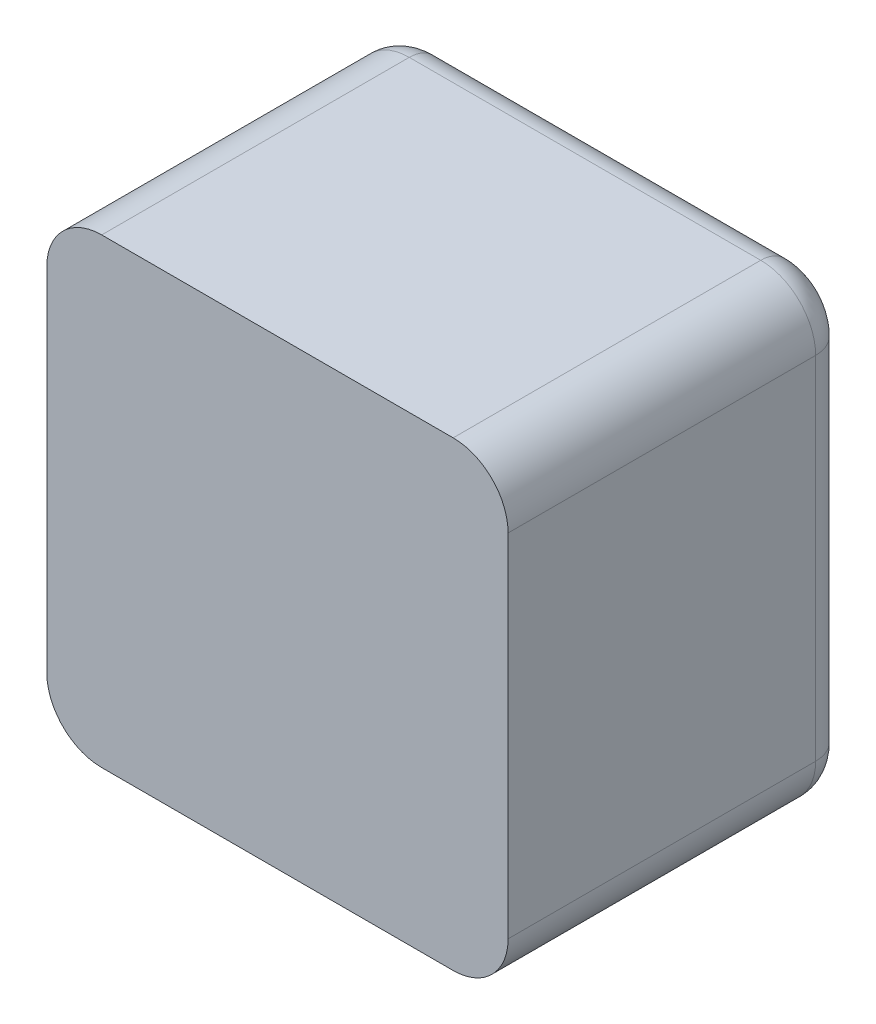
ISO-10303-21;
HEADER;
FILE_DESCRIPTION(('STEP AP214'),'2;1');
FILE_NAME('part.step','',(''),(''),'','','');
FILE_SCHEMA(('AUTOMOTIVE_DESIGN { 1 0 10303 214 1 1 1 1 }'));
ENDSEC;
DATA;
#1=APPLICATION_CONTEXT('core data for automotive mechanical design processes');
#2=APPLICATION_PROTOCOL_DEFINITION('international standard','automotive_design',2000,#1);
#3=PRODUCT_CONTEXT('',#1,'mechanical');
#4=PRODUCT('Part','Part','',(#3));
#5=PRODUCT_RELATED_PRODUCT_CATEGORY('part','',(#4));
#6=PRODUCT_DEFINITION_FORMATION('','',#4);
#7=PRODUCT_DEFINITION_CONTEXT('part definition',#1,'design');
#8=PRODUCT_DEFINITION('design','',#6,#7);
#9=PRODUCT_DEFINITION_SHAPE('','',#8);
#10=(LENGTH_UNIT() NAMED_UNIT(*) SI_UNIT(.MILLI.,.METRE.));
#11=(NAMED_UNIT(*) PLANE_ANGLE_UNIT() SI_UNIT($,.RADIAN.));
#12=(NAMED_UNIT(*) SI_UNIT($,.STERADIAN.) SOLID_ANGLE_UNIT());
#13=UNCERTAINTY_MEASURE_WITH_UNIT(LENGTH_MEASURE(1.E-05),#10,'distance_accuracy_value','');
#14=(GEOMETRIC_REPRESENTATION_CONTEXT(3) GLOBAL_UNCERTAINTY_ASSIGNED_CONTEXT((#13)) GLOBAL_UNIT_ASSIGNED_CONTEXT((#10,
#11,#12)) REPRESENTATION_CONTEXT('',''));
#15=CARTESIAN_POINT('',(0.,0.,0.));
#16=DIRECTION('',(0.,0.,1.));
#17=DIRECTION('',(1.,0.,0.));
#18=AXIS2_PLACEMENT_3D('',#15,#16,#17);
#19=CARTESIAN_POINT('',(-29.6481980703746,-27.890625,60.));
#20=DIRECTION('',(0.,1.,0.));
#21=DIRECTION('',(0.,0.,1.));
#22=AXIS2_PLACEMENT_3D('',#19,#20,#21);
#23=PLANE('',#22);
#24=DIRECTION('',(0.,0.,-1.));
#25=VECTOR('',#24,1.);
#26=CARTESIAN_POINT('',(-19.6481980703746,-27.890625,60.));
#27=LINE('',#26,#25);
#28=CARTESIAN_POINT('',(-19.6481980703746,-27.890625,62.));
#29=VERTEX_POINT('',#28);
#30=CARTESIAN_POINT('',(-19.6481980703746,-27.890625,6.));
#31=VERTEX_POINT('',#30);
#32=EDGE_CURVE('E199',#29,#31,#27,.T.);
#33=ORIENTED_EDGE('',*,*,#32,.T.);
#34=DIRECTION('',(1.,0.,0.));
#35=VECTOR('',#34,1.);
#36=CARTESIAN_POINT('',(-29.6481980703746,-27.890625,6.));
#37=LINE('',#36,#35);
#38=CARTESIAN_POINT('',(44.3518019296254,-27.890625,6.));
#39=VERTEX_POINT('',#38);
#40=EDGE_CURVE('E381',#31,#39,#37,.T.);
#41=ORIENTED_EDGE('',*,*,#40,.T.);
#42=DIRECTION('',(0.,0.,-1.));
#43=VECTOR('',#42,1.);
#44=CARTESIAN_POINT('',(44.3518019296254,-27.890625,60.));
#45=LINE('',#44,#43);
#46=CARTESIAN_POINT('',(44.3518019296253,-27.890625,62.));
#47=VERTEX_POINT('',#46);
#48=EDGE_CURVE('E210',#39,#47,#45,.F.);
#49=ORIENTED_EDGE('',*,*,#48,.T.);
#50=DIRECTION('',(1.,0.,0.));
#51=VECTOR('',#50,1.);
#52=CARTESIAN_POINT('',(-19.6481980703746,-27.890625,62.));
#53=LINE('',#52,#51);
#54=EDGE_CURVE('E213',#29,#47,#53,.T.);
#55=ORIENTED_EDGE('',*,*,#54,.F.);
#56=EDGE_LOOP('',(#33,#41,#49,#55));
#57=FACE_BOUND('',#56,.T.);
#58=DIRECTION('',(-1.,0.,0.));
#59=VECTOR('',#58,1.);
#60=CARTESIAN_POINT('',(24.3518019296254,-27.890625,57.));
#61=LINE('',#60,#59);
#62=CARTESIAN_POINT('',(24.3518019296254,-27.890625,57.));
#63=VERTEX_POINT('',#62);
#64=CARTESIAN_POINT('',(0.351801929625378,-27.890625,57.));
#65=VERTEX_POINT('',#64);
#66=EDGE_CURVE('E280',#63,#65,#61,.T.);
#67=ORIENTED_EDGE('',*,*,#66,.F.);
#68=CARTESIAN_POINT('',(24.3518019296254,-27.890625,42.));
#69=DIRECTION('',(0.,1.,0.));
#70=DIRECTION('',(0.,0.,1.));
#71=AXIS2_PLACEMENT_3D('',#68,#69,#70);
#72=CIRCLE('',#71,15.);
#73=CARTESIAN_POINT('',(39.3518019296254,-27.890625,42.));
#74=VERTEX_POINT('',#73);
#75=EDGE_CURVE('E287',#63,#74,#72,.T.);
#76=ORIENTED_EDGE('',*,*,#75,.T.);
#77=DIRECTION('',(0.,0.,-1.));
#78=VECTOR('',#77,1.);
#79=CARTESIAN_POINT('',(39.3518019296254,-27.890625,42.));
#80=LINE('',#79,#78);
#81=CARTESIAN_POINT('',(39.3518019296254,-27.890625,25.));
#82=VERTEX_POINT('',#81);
#83=EDGE_CURVE('E62',#74,#82,#80,.T.);
#84=ORIENTED_EDGE('',*,*,#83,.T.);
#85=CARTESIAN_POINT('',(24.3518019296254,-27.890625,25.));
#86=DIRECTION('',(0.,1.,0.));
#87=DIRECTION('',(0.,0.,1.));
#88=AXIS2_PLACEMENT_3D('',#85,#86,#87);
#89=CIRCLE('',#88,15.);
#90=CARTESIAN_POINT('',(24.3518019296254,-27.890625,10.));
#91=VERTEX_POINT('',#90);
#92=EDGE_CURVE('E320',#82,#91,#89,.T.);
#93=ORIENTED_EDGE('',*,*,#92,.T.);
#94=DIRECTION('',(-1.,0.,0.));
#95=VECTOR('',#94,1.);
#96=CARTESIAN_POINT('',(24.3518019296254,-27.890625,9.99999999999999));
#97=LINE('',#96,#95);
#98=CARTESIAN_POINT('',(0.35180192962538,-27.890625,9.99999999999999));
#99=VERTEX_POINT('',#98);
#100=EDGE_CURVE('E317',#91,#99,#97,.T.);
#101=ORIENTED_EDGE('',*,*,#100,.T.);
#102=CARTESIAN_POINT('',(0.351801929625378,-27.890625,25.));
#103=DIRECTION('',(0.,1.,0.));
#104=DIRECTION('',(0.,0.,1.));
#105=AXIS2_PLACEMENT_3D('',#102,#103,#104);
#106=CIRCLE('',#105,15.);
#107=CARTESIAN_POINT('',(-14.6481980703746,-27.890625,25.));
#108=VERTEX_POINT('',#107);
#109=EDGE_CURVE('E314',#99,#108,#106,.T.);
#110=ORIENTED_EDGE('',*,*,#109,.T.);
#111=DIRECTION('',(0.,0.,-1.));
#112=VECTOR('',#111,1.);
#113=CARTESIAN_POINT('',(-14.6481980703746,-27.890625,42.));
#114=LINE('',#113,#112);
#115=CARTESIAN_POINT('',(-14.6481980703746,-27.890625,42.));
#116=VERTEX_POINT('',#115);
#117=EDGE_CURVE('E311',#116,#108,#114,.T.);
#118=ORIENTED_EDGE('',*,*,#117,.F.);
#119=CARTESIAN_POINT('',(0.351801929625376,-27.890625,42.));
#120=DIRECTION('',(0.,-1.,0.));
#121=DIRECTION('',(0.,0.,-1.));
#122=AXIS2_PLACEMENT_3D('',#119,#120,#121);
#123=CIRCLE('',#122,15.);
#124=EDGE_CURVE('E309',#65,#116,#123,.T.);
#125=ORIENTED_EDGE('',*,*,#124,.F.);
#126=EDGE_LOOP('',(#67,#76,#84,#93,#101,#110,#118,#125));
#127=FACE_BOUND('',#126,.T.);
#128=ADVANCED_FACE('F37',(#57,#127),#23,.F.);
#129=CARTESIAN_POINT('',(-29.6481980703746,56.109375,60.));
#130=DIRECTION('',(1.,0.,0.));
#131=DIRECTION('',(0.,1.,0.));
#132=AXIS2_PLACEMENT_3D('',#129,#130,#131);
#133=PLANE('',#132);
#134=DIRECTION('',(0.,0.,-1.));
#135=VECTOR('',#134,1.);
#136=CARTESIAN_POINT('',(-29.6481980703746,46.109375,0.));
#137=LINE('',#136,#135);
#138=CARTESIAN_POINT('',(-29.6481980703746,46.1093749999999,62.));
#139=VERTEX_POINT('',#138);
#140=CARTESIAN_POINT('',(-29.6481980703746,46.109375,6.));
#141=VERTEX_POINT('',#140);
#142=EDGE_CURVE('E209',#139,#141,#137,.T.);
#143=ORIENTED_EDGE('',*,*,#142,.T.);
#144=DIRECTION('',(0.,-1.,0.));
#145=VECTOR('',#144,1.);
#146=CARTESIAN_POINT('',(-29.6481980703746,56.109375,6.));
#147=LINE('',#146,#145);
#148=CARTESIAN_POINT('',(-29.6481980703746,-17.890625,6.));
#149=VERTEX_POINT('',#148);
#150=EDGE_CURVE('E378',#141,#149,#147,.T.);
#151=ORIENTED_EDGE('',*,*,#150,.T.);
#152=DIRECTION('',(0.,0.,-1.));
#153=VECTOR('',#152,1.);
#154=CARTESIAN_POINT('',(-29.6481980703746,-17.890625,60.));
#155=LINE('',#154,#153);
#156=CARTESIAN_POINT('',(-29.6481980703746,-17.8906249999999,62.));
#157=VERTEX_POINT('',#156);
#158=EDGE_CURVE('E346',#149,#157,#155,.F.);
#159=ORIENTED_EDGE('',*,*,#158,.T.);
#160=DIRECTION('',(0.,-1.,0.));
#161=VECTOR('',#160,1.);
#162=CARTESIAN_POINT('',(-29.6481980703746,46.1093749999999,62.));
#163=LINE('',#162,#161);
#164=EDGE_CURVE('E225',#139,#157,#163,.T.);
#165=ORIENTED_EDGE('',*,*,#164,.F.);
#166=EDGE_LOOP('',(#143,#151,#159,#165));
#167=FACE_BOUND('',#166,.T.);
#168=ADVANCED_FACE('F451',(#167),#133,.F.);
#169=CARTESIAN_POINT('',(54.3518019296254,56.109375,60.));
#170=DIRECTION('',(1.,0.,0.));
#171=DIRECTION('',(0.,1.,0.));
#172=AXIS2_PLACEMENT_3D('',#169,#170,#171);
#173=PLANE('',#172);
#174=DIRECTION('',(0.,0.,-1.));
#175=VECTOR('',#174,1.);
#176=CARTESIAN_POINT('',(54.3518019296254,-17.890625,0.));
#177=LINE('',#176,#175);
#178=CARTESIAN_POINT('',(54.3518019296254,-17.8906249999999,62.));
#179=VERTEX_POINT('',#178);
#180=CARTESIAN_POINT('',(54.3518019296254,-17.890625,6.));
#181=VERTEX_POINT('',#180);
#182=EDGE_CURVE('E350',#179,#181,#177,.T.);
#183=ORIENTED_EDGE('',*,*,#182,.T.);
#184=DIRECTION('',(0.,-1.,0.));
#185=VECTOR('',#184,1.);
#186=CARTESIAN_POINT('',(54.3518019296254,46.109375,6.));
#187=LINE('',#186,#185);
#188=CARTESIAN_POINT('',(54.3518019296254,46.109375,6.));
#189=VERTEX_POINT('',#188);
#190=EDGE_CURVE('E385',#181,#189,#187,.F.);
#191=ORIENTED_EDGE('',*,*,#190,.T.);
#192=DIRECTION('',(0.,0.,-1.));
#193=VECTOR('',#192,1.);
#194=CARTESIAN_POINT('',(54.3518019296254,46.109375,60.));
#195=LINE('',#194,#193);
#196=CARTESIAN_POINT('',(54.3518019296254,46.1093749999999,62.));
#197=VERTEX_POINT('',#196);
#198=EDGE_CURVE('E348',#189,#197,#195,.F.);
#199=ORIENTED_EDGE('',*,*,#198,.T.);
#200=DIRECTION('',(0.,1.,0.));
#201=VECTOR('',#200,1.);
#202=CARTESIAN_POINT('',(54.3518019296254,46.1093749999999,62.));
#203=LINE('',#202,#201);
#204=EDGE_CURVE('E229',#179,#197,#203,.T.);
#205=ORIENTED_EDGE('',*,*,#204,.F.);
#206=EDGE_LOOP('',(#183,#191,#199,#205));
#207=FACE_BOUND('',#206,.T.);
#208=ADVANCED_FACE('F421',(#207),#173,.T.);
#209=CARTESIAN_POINT('',(-29.6481980703746,56.109375,60.));
#210=DIRECTION('',(0.,1.,0.));
#211=DIRECTION('',(0.,0.,1.));
#212=AXIS2_PLACEMENT_3D('',#209,#210,#211);
#213=PLANE('',#212);
#214=DIRECTION('',(0.,0.,-1.));
#215=VECTOR('',#214,1.);
#216=CARTESIAN_POINT('',(44.3518019296254,56.109375,60.));
#217=LINE('',#216,#215);
#218=CARTESIAN_POINT('',(44.3518019296253,56.109375,62.));
#219=VERTEX_POINT('',#218);
#220=CARTESIAN_POINT('',(44.3518019296254,56.109375,6.));
#221=VERTEX_POINT('',#220);
#222=EDGE_CURVE('E353',#219,#221,#217,.T.);
#223=ORIENTED_EDGE('',*,*,#222,.T.);
#224=DIRECTION('',(1.,0.,0.));
#225=VECTOR('',#224,1.);
#226=CARTESIAN_POINT('',(-19.6481980703746,56.109375,6.));
#227=LINE('',#226,#225);
#228=CARTESIAN_POINT('',(-19.6481980703746,56.109375,6.));
#229=VERTEX_POINT('',#228);
#230=EDGE_CURVE('E11',#221,#229,#227,.F.);
#231=ORIENTED_EDGE('',*,*,#230,.T.);
#232=DIRECTION('',(0.,0.,-1.));
#233=VECTOR('',#232,1.);
#234=CARTESIAN_POINT('',(-19.6481980703746,56.109375,60.));
#235=LINE('',#234,#233);
#236=CARTESIAN_POINT('',(-19.6481980703746,56.109375,62.));
#237=VERTEX_POINT('',#236);
#238=EDGE_CURVE('E356',#229,#237,#235,.F.);
#239=ORIENTED_EDGE('',*,*,#238,.T.);
#240=DIRECTION('',(-1.,0.,0.));
#241=VECTOR('',#240,1.);
#242=CARTESIAN_POINT('',(-19.6481980703746,56.109375,62.));
#243=LINE('',#242,#241);
#244=EDGE_CURVE('E235',#219,#237,#243,.T.);
#245=ORIENTED_EDGE('',*,*,#244,.F.);
#246=EDGE_LOOP('',(#223,#231,#239,#245));
#247=FACE_BOUND('',#246,.T.);
#248=ADVANCED_FACE('F431',(#247),#213,.T.);
#249=CARTESIAN_POINT('',(0.,0.,0.));
#250=DIRECTION('',(0.,0.,1.));
#251=DIRECTION('',(1.,0.,0.));
#252=AXIS2_PLACEMENT_3D('',#249,#250,#251);
#253=PLANE('',#252);
#254=CARTESIAN_POINT('',(14.3518019296254,21.109375,0.));
#255=DIRECTION('',(0.,0.,-1.));
#256=DIRECTION('',(-1.,0.,0.));
#257=AXIS2_PLACEMENT_3D('',#254,#255,#256);
#258=CIRCLE('',#257,3.175);
#259=CARTESIAN_POINT('',(11.1768019296254,21.109375,0.));
#260=VERTEX_POINT('',#259);
#261=EDGE_CURVE('E241',#260,#260,#258,.T.);
#262=ORIENTED_EDGE('',*,*,#261,.F.);
#263=EDGE_LOOP('',(#262));
#264=FACE_BOUND('',#263,.T.);
#265=DIRECTION('',(-1.,0.,0.));
#266=VECTOR('',#265,1.);
#267=CARTESIAN_POINT('',(34.8518019296254,-14.890625,0.));
#268=LINE('',#267,#266);
#269=CARTESIAN_POINT('',(34.8518019296254,-14.890625,0.));
#270=VERTEX_POINT('',#269);
#271=CARTESIAN_POINT('',(-10.1481980703746,-14.890625,0.));
#272=VERTEX_POINT('',#271);
#273=EDGE_CURVE('E261',#270,#272,#268,.T.);
#274=ORIENTED_EDGE('',*,*,#273,.F.);
#275=CARTESIAN_POINT('',(34.8518019296254,-8.39062500000001,0.));
#276=DIRECTION('',(0.,0.,-1.));
#277=DIRECTION('',(-1.,0.,0.));
#278=AXIS2_PLACEMENT_3D('',#275,#276,#277);
#279=CIRCLE('',#278,6.5);
#280=CARTESIAN_POINT('',(34.8518019296254,-1.890625,0.));
#281=VERTEX_POINT('',#280);
#282=EDGE_CURVE('E54',#281,#270,#279,.T.);
#283=ORIENTED_EDGE('',*,*,#282,.F.);
#284=DIRECTION('',(-1.,0.,0.));
#285=VECTOR('',#284,1.);
#286=CARTESIAN_POINT('',(34.8518019296254,-1.890625,0.));
#287=LINE('',#286,#285);
#288=CARTESIAN_POINT('',(-10.1481980703746,-1.890625,0.));
#289=VERTEX_POINT('',#288);
#290=EDGE_CURVE('E251',#281,#289,#287,.T.);
#291=ORIENTED_EDGE('',*,*,#290,.T.);
#292=CARTESIAN_POINT('',(-10.1481980703746,-8.390625,0.));
#293=DIRECTION('',(0.,0.,-1.));
#294=DIRECTION('',(-1.,0.,0.));
#295=AXIS2_PLACEMENT_3D('',#292,#293,#294);
#296=CIRCLE('',#295,6.5);
#297=EDGE_CURVE('E264',#272,#289,#296,.T.);
#298=ORIENTED_EDGE('',*,*,#297,.F.);
#299=EDGE_LOOP('',(#274,#283,#291,#298));
#300=FACE_BOUND('',#299,.T.);
#301=DIRECTION('',(0.,-1.,0.));
#302=VECTOR('',#301,1.);
#303=CARTESIAN_POINT('',(-23.6481980703746,0.,0.));
#304=LINE('',#303,#302);
#305=CARTESIAN_POINT('',(-23.6481980703746,-17.890625,0.));
#306=VERTEX_POINT('',#305);
#307=CARTESIAN_POINT('',(-23.6481980703746,46.109375,0.));
#308=VERTEX_POINT('',#307);
#309=EDGE_CURVE('E370',#306,#308,#304,.F.);
#310=ORIENTED_EDGE('',*,*,#309,.T.);
#311=CARTESIAN_POINT('',(-19.6481980703746,46.109375,0.));
#312=DIRECTION('',(0.,0.,1.));
#313=DIRECTION('',(1.,0.,0.));
#314=AXIS2_PLACEMENT_3D('',#311,#312,#313);
#315=CIRCLE('',#314,4.);
#316=CARTESIAN_POINT('',(-19.6481980703746,50.109375,0.));
#317=VERTEX_POINT('',#316);
#318=EDGE_CURVE('E372',#308,#317,#315,.F.);
#319=ORIENTED_EDGE('',*,*,#318,.T.);
#320=DIRECTION('',(1.,0.,0.));
#321=VECTOR('',#320,1.);
#322=CARTESIAN_POINT('',(44.3518019296253,50.109375,0.));
#323=LINE('',#322,#321);
#324=CARTESIAN_POINT('',(44.3518019296254,50.109375,0.));
#325=VERTEX_POINT('',#324);
#326=EDGE_CURVE('E358',#317,#325,#323,.T.);
#327=ORIENTED_EDGE('',*,*,#326,.T.);
#328=CARTESIAN_POINT('',(44.3518019296254,46.109375,0.));
#329=DIRECTION('',(0.,0.,1.));
#330=DIRECTION('',(1.,0.,0.));
#331=AXIS2_PLACEMENT_3D('',#328,#329,#330);
#332=CIRCLE('',#331,4.);
#333=CARTESIAN_POINT('',(48.3518019296254,46.109375,0.));
#334=VERTEX_POINT('',#333);
#335=EDGE_CURVE('E360',#325,#334,#332,.F.);
#336=ORIENTED_EDGE('',*,*,#335,.T.);
#337=DIRECTION('',(0.,-1.,0.));
#338=VECTOR('',#337,1.);
#339=CARTESIAN_POINT('',(48.3518019296254,-17.890625,0.));
#340=LINE('',#339,#338);
#341=CARTESIAN_POINT('',(48.3518019296254,-17.890625,0.));
#342=VERTEX_POINT('',#341);
#343=EDGE_CURVE('E362',#334,#342,#340,.T.);
#344=ORIENTED_EDGE('',*,*,#343,.T.);
#345=CARTESIAN_POINT('',(44.3518019296254,-17.890625,0.));
#346=DIRECTION('',(0.,0.,1.));
#347=DIRECTION('',(1.,0.,0.));
#348=AXIS2_PLACEMENT_3D('',#345,#346,#347);
#349=CIRCLE('',#348,4.);
#350=CARTESIAN_POINT('',(44.3518019296254,-21.890625,0.));
#351=VERTEX_POINT('',#350);
#352=EDGE_CURVE('E364',#342,#351,#349,.F.);
#353=ORIENTED_EDGE('',*,*,#352,.T.);
#354=DIRECTION('',(1.,0.,0.));
#355=VECTOR('',#354,1.);
#356=CARTESIAN_POINT('',(0.,-21.890625,0.));
#357=LINE('',#356,#355);
#358=CARTESIAN_POINT('',(-19.6481980703746,-21.890625,0.));
#359=VERTEX_POINT('',#358);
#360=EDGE_CURVE('E366',#351,#359,#357,.F.);
#361=ORIENTED_EDGE('',*,*,#360,.T.);
#362=CARTESIAN_POINT('',(-19.6481980703746,-17.890625,0.));
#363=DIRECTION('',(0.,0.,1.));
#364=DIRECTION('',(1.,0.,0.));
#365=AXIS2_PLACEMENT_3D('',#362,#363,#364);
#366=CIRCLE('',#365,4.);
#367=EDGE_CURVE('E368',#359,#306,#366,.F.);
#368=ORIENTED_EDGE('',*,*,#367,.T.);
#369=EDGE_LOOP('',(#310,#319,#327,#336,#344,#353,#361,#368));
#370=FACE_BOUND('',#369,.T.);
#371=ADVANCED_FACE('F460',(#264,#300,#370),#253,.F.);
#372=CARTESIAN_POINT('',(-19.6481980703746,-17.890625,60.));
#373=DIRECTION('',(0.,0.,-1.));
#374=DIRECTION('',(-1.,0.,0.));
#375=AXIS2_PLACEMENT_3D('',#372,#373,#374);
#376=CYLINDRICAL_SURFACE('',#375,10.);
#377=ORIENTED_EDGE('',*,*,#158,.F.);
#378=CARTESIAN_POINT('',(-19.6481980703746,-17.890625,6.));
#379=DIRECTION('',(0.,0.,1.));
#380=DIRECTION('',(1.,0.,0.));
#381=AXIS2_PLACEMENT_3D('',#378,#379,#380);
#382=CIRCLE('',#381,10.);
#383=EDGE_CURVE('E206',#149,#31,#382,.T.);
#384=ORIENTED_EDGE('',*,*,#383,.T.);
#385=ORIENTED_EDGE('',*,*,#32,.F.);
#386=CARTESIAN_POINT('',(-19.6481980703746,-17.890625,62.));
#387=DIRECTION('',(0.,0.,1.));
#388=DIRECTION('',(1.,0.,0.));
#389=AXIS2_PLACEMENT_3D('',#386,#387,#388);
#390=CIRCLE('',#389,10.);
#391=EDGE_CURVE('E204',#157,#29,#390,.T.);
#392=ORIENTED_EDGE('',*,*,#391,.F.);
#393=EDGE_LOOP('',(#377,#384,#385,#392));
#394=FACE_BOUND('',#393,.T.);
#395=ADVANCED_FACE('F202',(#394),#376,.T.);
#396=CARTESIAN_POINT('',(44.3518019296254,-17.890625,60.));
#397=DIRECTION('',(0.,0.,1.));
#398=DIRECTION('',(1.,0.,0.));
#399=AXIS2_PLACEMENT_3D('',#396,#397,#398);
#400=CYLINDRICAL_SURFACE('',#399,10.);
#401=ORIENTED_EDGE('',*,*,#48,.F.);
#402=CARTESIAN_POINT('',(44.3518019296254,-17.890625,6.));
#403=DIRECTION('',(0.,0.,1.));
#404=DIRECTION('',(1.,0.,0.));
#405=AXIS2_PLACEMENT_3D('',#402,#403,#404);
#406=CIRCLE('',#405,10.);
#407=EDGE_CURVE('E383',#39,#181,#406,.T.);
#408=ORIENTED_EDGE('',*,*,#407,.T.);
#409=ORIENTED_EDGE('',*,*,#182,.F.);
#410=CARTESIAN_POINT('',(44.3518019296254,-17.890625,62.));
#411=DIRECTION('',(0.,0.,1.));
#412=DIRECTION('',(1.,0.,0.));
#413=AXIS2_PLACEMENT_3D('',#410,#411,#412);
#414=CIRCLE('',#413,10.);
#415=EDGE_CURVE('E219',#47,#179,#414,.T.);
#416=ORIENTED_EDGE('',*,*,#415,.F.);
#417=EDGE_LOOP('',(#401,#408,#409,#416));
#418=FACE_BOUND('',#417,.T.);
#419=ADVANCED_FACE('F418',(#418),#400,.T.);
#420=CARTESIAN_POINT('',(-19.6481980703746,46.109375,60.));
#421=DIRECTION('',(0.,0.,1.));
#422=DIRECTION('',(1.,0.,0.));
#423=AXIS2_PLACEMENT_3D('',#420,#421,#422);
#424=CYLINDRICAL_SURFACE('',#423,10.);
#425=ORIENTED_EDGE('',*,*,#238,.F.);
#426=CARTESIAN_POINT('',(-19.6481980703746,46.109375,6.));
#427=DIRECTION('',(0.,0.,1.));
#428=DIRECTION('',(1.,0.,0.));
#429=AXIS2_PLACEMENT_3D('',#426,#427,#428);
#430=CIRCLE('',#429,10.);
#431=EDGE_CURVE('E375',#229,#141,#430,.T.);
#432=ORIENTED_EDGE('',*,*,#431,.T.);
#433=ORIENTED_EDGE('',*,*,#142,.F.);
#434=CARTESIAN_POINT('',(-19.6481980703746,46.109375,62.));
#435=DIRECTION('',(0.,0.,1.));
#436=DIRECTION('',(1.,0.,0.));
#437=AXIS2_PLACEMENT_3D('',#434,#435,#436);
#438=CIRCLE('',#437,10.);
#439=EDGE_CURVE('E238',#237,#139,#438,.T.);
#440=ORIENTED_EDGE('',*,*,#439,.F.);
#441=EDGE_LOOP('',(#425,#432,#433,#440));
#442=FACE_BOUND('',#441,.T.);
#443=ADVANCED_FACE('F448',(#442),#424,.T.);
#444=CARTESIAN_POINT('',(44.3518019296254,46.109375,60.));
#445=DIRECTION('',(0.,0.,-1.));
#446=DIRECTION('',(-1.,0.,0.));
#447=AXIS2_PLACEMENT_3D('',#444,#445,#446);
#448=CYLINDRICAL_SURFACE('',#447,10.);
#449=ORIENTED_EDGE('',*,*,#198,.F.);
#450=CARTESIAN_POINT('',(44.3518019296254,46.109375,6.));
#451=DIRECTION('',(0.,0.,1.));
#452=DIRECTION('',(1.,0.,0.));
#453=AXIS2_PLACEMENT_3D('',#450,#451,#452);
#454=CIRCLE('',#453,10.);
#455=EDGE_CURVE('E46',#189,#221,#454,.T.);
#456=ORIENTED_EDGE('',*,*,#455,.T.);
#457=ORIENTED_EDGE('',*,*,#222,.F.);
#458=CARTESIAN_POINT('',(44.3518019296254,46.109375,62.));
#459=DIRECTION('',(0.,0.,1.));
#460=DIRECTION('',(-1.,0.,0.));
#461=AXIS2_PLACEMENT_3D('',#458,#459,#460);
#462=CIRCLE('',#461,10.);
#463=EDGE_CURVE('E232',#197,#219,#462,.T.);
#464=ORIENTED_EDGE('',*,*,#463,.F.);
#465=EDGE_LOOP('',(#449,#456,#457,#464));
#466=FACE_BOUND('',#465,.T.);
#467=ADVANCED_FACE('F426',(#466),#448,.T.);
#468=CARTESIAN_POINT('',(44.3518019296254,-17.890625,6.));
#469=DIRECTION('',(0.,0.,1.));
#470=DIRECTION('',(1.,0.,0.));
#471=AXIS2_PLACEMENT_3D('',#468,#469,#470);
#472=DEGENERATE_TOROIDAL_SURFACE('',#471,4.,6.,.T.);
#473=CARTESIAN_POINT('',(48.3518019296254,-17.890625,6.));
#474=DIRECTION('',(0.,1.,0.));
#475=DIRECTION('',(-1.,0.,0.));
#476=AXIS2_PLACEMENT_3D('',#473,#474,#475);
#477=CIRCLE('',#476,6.);
#478=EDGE_CURVE('E402',#181,#342,#477,.T.);
#479=ORIENTED_EDGE('',*,*,#478,.F.);
#480=ORIENTED_EDGE('',*,*,#407,.F.);
#481=CARTESIAN_POINT('',(44.3518019296254,-21.890625,6.));
#482=DIRECTION('',(-1.,0.,0.));
#483=DIRECTION('',(0.,0.,1.));
#484=AXIS2_PLACEMENT_3D('',#481,#482,#483);
#485=CIRCLE('',#484,6.);
#486=EDGE_CURVE('E41',#351,#39,#485,.T.);
#487=ORIENTED_EDGE('',*,*,#486,.F.);
#488=ORIENTED_EDGE('',*,*,#352,.F.);
#489=EDGE_LOOP('',(#479,#480,#487,#488));
#490=FACE_BOUND('',#489,.T.);
#491=ADVANCED_FACE('F39',(#490),#472,.T.);
#492=CARTESIAN_POINT('',(-29.6481980703746,-21.890625,6.));
#493=DIRECTION('',(1.,0.,0.));
#494=DIRECTION('',(0.,0.,-1.));
#495=AXIS2_PLACEMENT_3D('',#492,#493,#494);
#496=CYLINDRICAL_SURFACE('',#495,6.);
#497=ORIENTED_EDGE('',*,*,#486,.T.);
#498=ORIENTED_EDGE('',*,*,#40,.F.);
#499=CARTESIAN_POINT('',(-19.6481980703746,-21.890625,6.));
#500=DIRECTION('',(-1.,0.,0.));
#501=DIRECTION('',(0.,0.,1.));
#502=AXIS2_PLACEMENT_3D('',#499,#500,#501);
#503=CIRCLE('',#502,6.);
#504=EDGE_CURVE('E400',#359,#31,#503,.T.);
#505=ORIENTED_EDGE('',*,*,#504,.F.);
#506=ORIENTED_EDGE('',*,*,#360,.F.);
#507=EDGE_LOOP('',(#497,#498,#505,#506));
#508=FACE_BOUND('',#507,.T.);
#509=ADVANCED_FACE('F412',(#508),#496,.T.);
#510=CARTESIAN_POINT('',(48.3518019296254,0.,6.));
#511=DIRECTION('',(0.,1.,0.));
#512=DIRECTION('',(-1.,0.,0.));
#513=AXIS2_PLACEMENT_3D('',#510,#511,#512);
#514=CYLINDRICAL_SURFACE('',#513,6.);
#515=ORIENTED_EDGE('',*,*,#478,.T.);
#516=ORIENTED_EDGE('',*,*,#343,.F.);
#517=CARTESIAN_POINT('',(48.3518019296254,46.109375,6.));
#518=DIRECTION('',(0.,1.,0.));
#519=DIRECTION('',(0.,0.,1.));
#520=AXIS2_PLACEMENT_3D('',#517,#518,#519);
#521=CIRCLE('',#520,6.);
#522=EDGE_CURVE('E397',#189,#334,#521,.T.);
#523=ORIENTED_EDGE('',*,*,#522,.F.);
#524=ORIENTED_EDGE('',*,*,#190,.F.);
#525=EDGE_LOOP('',(#515,#516,#523,#524));
#526=FACE_BOUND('',#525,.T.);
#527=ADVANCED_FACE('F461',(#526),#514,.T.);
#528=CARTESIAN_POINT('',(-19.6481980703746,-17.890625,6.));
#529=DIRECTION('',(0.,0.,1.));
#530=DIRECTION('',(1.,0.,0.));
#531=AXIS2_PLACEMENT_3D('',#528,#529,#530);
#532=DEGENERATE_TOROIDAL_SURFACE('',#531,4.,6.,.T.);
#533=ORIENTED_EDGE('',*,*,#504,.T.);
#534=ORIENTED_EDGE('',*,*,#383,.F.);
#535=CARTESIAN_POINT('',(-23.6481980703746,-17.890625,6.));
#536=DIRECTION('',(0.,1.,0.));
#537=DIRECTION('',(0.,0.,1.));
#538=AXIS2_PLACEMENT_3D('',#535,#536,#537);
#539=CIRCLE('',#538,6.);
#540=EDGE_CURVE('E394',#306,#149,#539,.T.);
#541=ORIENTED_EDGE('',*,*,#540,.F.);
#542=ORIENTED_EDGE('',*,*,#367,.F.);
#543=EDGE_LOOP('',(#533,#534,#541,#542));
#544=FACE_BOUND('',#543,.T.);
#545=ADVANCED_FACE('F454',(#544),#532,.T.);
#546=CARTESIAN_POINT('',(44.3518019296254,46.109375,6.));
#547=DIRECTION('',(0.,0.,1.));
#548=DIRECTION('',(1.,0.,0.));
#549=AXIS2_PLACEMENT_3D('',#546,#547,#548);
#550=DEGENERATE_TOROIDAL_SURFACE('',#549,4.,6.,.T.);
#551=ORIENTED_EDGE('',*,*,#522,.T.);
#552=ORIENTED_EDGE('',*,*,#335,.F.);
#553=CARTESIAN_POINT('',(44.3518019296254,50.109375,6.));
#554=DIRECTION('',(-1.,0.,0.));
#555=DIRECTION('',(0.,0.,1.));
#556=AXIS2_PLACEMENT_3D('',#553,#554,#555);
#557=CIRCLE('',#556,6.);
#558=EDGE_CURVE('E391',#221,#325,#557,.T.);
#559=ORIENTED_EDGE('',*,*,#558,.F.);
#560=ORIENTED_EDGE('',*,*,#455,.F.);
#561=EDGE_LOOP('',(#551,#552,#559,#560));
#562=FACE_BOUND('',#561,.T.);
#563=ADVANCED_FACE('F436',(#562),#550,.T.);
#564=CARTESIAN_POINT('',(-23.6481980703746,56.109375,6.));
#565=DIRECTION('',(0.,-1.,0.));
#566=DIRECTION('',(1.,0.,0.));
#567=AXIS2_PLACEMENT_3D('',#564,#565,#566);
#568=CYLINDRICAL_SURFACE('',#567,6.);
#569=ORIENTED_EDGE('',*,*,#540,.T.);
#570=ORIENTED_EDGE('',*,*,#150,.F.);
#571=CARTESIAN_POINT('',(-23.6481980703746,46.109375,6.));
#572=DIRECTION('',(0.,1.,0.));
#573=DIRECTION('',(0.,0.,1.));
#574=AXIS2_PLACEMENT_3D('',#571,#572,#573);
#575=CIRCLE('',#574,6.);
#576=EDGE_CURVE('E389',#308,#141,#575,.T.);
#577=ORIENTED_EDGE('',*,*,#576,.F.);
#578=ORIENTED_EDGE('',*,*,#309,.F.);
#579=EDGE_LOOP('',(#569,#570,#577,#578));
#580=FACE_BOUND('',#579,.T.);
#581=ADVANCED_FACE('F458',(#580),#568,.T.);
#582=CARTESIAN_POINT('',(0.,50.109375,6.));
#583=DIRECTION('',(-1.,0.,0.));
#584=DIRECTION('',(0.,0.,1.));
#585=AXIS2_PLACEMENT_3D('',#582,#583,#584);
#586=CYLINDRICAL_SURFACE('',#585,6.);
#587=ORIENTED_EDGE('',*,*,#558,.T.);
#588=ORIENTED_EDGE('',*,*,#326,.F.);
#589=CARTESIAN_POINT('',(-19.6481980703746,50.109375,6.));
#590=DIRECTION('',(-1.,0.,0.));
#591=DIRECTION('',(0.,0.,1.));
#592=AXIS2_PLACEMENT_3D('',#589,#590,#591);
#593=CIRCLE('',#592,6.);
#594=EDGE_CURVE('E342',#229,#317,#593,.T.);
#595=ORIENTED_EDGE('',*,*,#594,.F.);
#596=ORIENTED_EDGE('',*,*,#230,.F.);
#597=EDGE_LOOP('',(#587,#588,#595,#596));
#598=FACE_BOUND('',#597,.T.);
#599=ADVANCED_FACE('F440',(#598),#586,.T.);
#600=CARTESIAN_POINT('',(-19.6481980703746,46.109375,6.));
#601=DIRECTION('',(0.,0.,1.));
#602=DIRECTION('',(1.,0.,0.));
#603=AXIS2_PLACEMENT_3D('',#600,#601,#602);
#604=DEGENERATE_TOROIDAL_SURFACE('',#603,4.,6.,.T.);
#605=ORIENTED_EDGE('',*,*,#576,.T.);
#606=ORIENTED_EDGE('',*,*,#431,.F.);
#607=ORIENTED_EDGE('',*,*,#594,.T.);
#608=ORIENTED_EDGE('',*,*,#318,.F.);
#609=EDGE_LOOP('',(#605,#606,#607,#608));
#610=FACE_BOUND('',#609,.T.);
#611=ADVANCED_FACE('F444',(#610),#604,.T.);
#612=CARTESIAN_POINT('',(24.3518019296254,-29.890625,57.));
#613=DIRECTION('',(0.,0.,-1.));
#614=DIRECTION('',(-1.,0.,0.));
#615=AXIS2_PLACEMENT_3D('',#612,#613,#614);
#616=PLANE('',#615);
#617=ORIENTED_EDGE('',*,*,#66,.T.);
#618=DIRECTION('',(0.,1.,0.));
#619=VECTOR('',#618,1.);
#620=CARTESIAN_POINT('',(0.351801929625378,-29.890625,57.));
#621=LINE('',#620,#619);
#622=CARTESIAN_POINT('',(0.351801929625378,-29.890625,57.));
#623=VERTEX_POINT('',#622);
#624=EDGE_CURVE('E340',#623,#65,#621,.T.);
#625=ORIENTED_EDGE('',*,*,#624,.F.);
#626=DIRECTION('',(-1.,0.,0.));
#627=VECTOR('',#626,1.);
#628=CARTESIAN_POINT('',(24.3518019296254,-29.890625,57.));
#629=LINE('',#628,#627);
#630=CARTESIAN_POINT('',(24.3518019296254,-29.890625,57.));
#631=VERTEX_POINT('',#630);
#632=EDGE_CURVE('E283',#631,#623,#629,.T.);
#633=ORIENTED_EDGE('',*,*,#632,.F.);
#634=DIRECTION('',(0.,1.,0.));
#635=VECTOR('',#634,1.);
#636=CARTESIAN_POINT('',(24.3518019296254,-29.890625,57.));
#637=LINE('',#636,#635);
#638=EDGE_CURVE('E306',#631,#63,#637,.T.);
#639=ORIENTED_EDGE('',*,*,#638,.T.);
#640=EDGE_LOOP('',(#617,#625,#633,#639));
#641=FACE_BOUND('',#640,.T.);
#642=ADVANCED_FACE('F488',(#641),#616,.F.);
#643=CARTESIAN_POINT('',(0.351801929625376,-29.890625,42.));
#644=DIRECTION('',(0.,1.,0.));
#645=DIRECTION('',(0.,0.,1.));
#646=AXIS2_PLACEMENT_3D('',#643,#644,#645);
#647=CYLINDRICAL_SURFACE('',#646,15.);
#648=ORIENTED_EDGE('',*,*,#124,.T.);
#649=DIRECTION('',(0.,1.,0.));
#650=VECTOR('',#649,1.);
#651=CARTESIAN_POINT('',(-14.6481980703746,-29.890625,42.));
#652=LINE('',#651,#650);
#653=CARTESIAN_POINT('',(-14.6481980703746,-29.890625,42.));
#654=VERTEX_POINT('',#653);
#655=EDGE_CURVE('E337',#654,#116,#652,.T.);
#656=ORIENTED_EDGE('',*,*,#655,.F.);
#657=CARTESIAN_POINT('',(0.351801929625376,-29.890625,42.));
#658=DIRECTION('',(0.,-1.,0.));
#659=DIRECTION('',(0.,0.,-1.));
#660=AXIS2_PLACEMENT_3D('',#657,#658,#659);
#661=CIRCLE('',#660,15.);
#662=EDGE_CURVE('E286',#623,#654,#661,.T.);
#663=ORIENTED_EDGE('',*,*,#662,.F.);
#664=ORIENTED_EDGE('',*,*,#624,.T.);
#665=EDGE_LOOP('',(#648,#656,#663,#664));
#666=FACE_BOUND('',#665,.T.);
#667=ADVANCED_FACE('F516',(#666),#647,.T.);
#668=CARTESIAN_POINT('',(-14.6481980703746,-29.890625,42.));
#669=DIRECTION('',(1.,0.,0.));
#670=DIRECTION('',(0.,0.,-1.));
#671=AXIS2_PLACEMENT_3D('',#668,#669,#670);
#672=PLANE('',#671);
#673=ORIENTED_EDGE('',*,*,#117,.T.);
#674=DIRECTION('',(0.,1.,0.));
#675=VECTOR('',#674,1.);
#676=CARTESIAN_POINT('',(-14.6481980703746,-29.890625,25.));
#677=LINE('',#676,#675);
#678=CARTESIAN_POINT('',(-14.6481980703746,-29.890625,25.));
#679=VERTEX_POINT('',#678);
#680=EDGE_CURVE('E335',#679,#108,#677,.T.);
#681=ORIENTED_EDGE('',*,*,#680,.F.);
#682=DIRECTION('',(0.,0.,-1.));
#683=VECTOR('',#682,1.);
#684=CARTESIAN_POINT('',(-14.6481980703746,-29.890625,42.));
#685=LINE('',#684,#683);
#686=EDGE_CURVE('E289',#654,#679,#685,.T.);
#687=ORIENTED_EDGE('',*,*,#686,.F.);
#688=ORIENTED_EDGE('',*,*,#655,.T.);
#689=EDGE_LOOP('',(#673,#681,#687,#688));
#690=FACE_BOUND('',#689,.T.);
#691=ADVANCED_FACE('F524',(#690),#672,.F.);
#692=CARTESIAN_POINT('',(0.351801929625378,-29.890625,25.));
#693=DIRECTION('',(0.,1.,0.));
#694=DIRECTION('',(0.,0.,1.));
#695=AXIS2_PLACEMENT_3D('',#692,#693,#694);
#696=CYLINDRICAL_SURFACE('',#695,15.);
#697=ORIENTED_EDGE('',*,*,#109,.F.);
#698=DIRECTION('',(0.,1.,0.));
#699=VECTOR('',#698,1.);
#700=CARTESIAN_POINT('',(0.35180192962538,-29.890625,9.99999999999999));
#701=LINE('',#700,#699);
#702=CARTESIAN_POINT('',(0.35180192962538,-29.890625,9.99999999999999));
#703=VERTEX_POINT('',#702);
#704=EDGE_CURVE('E333',#703,#99,#701,.T.);
#705=ORIENTED_EDGE('',*,*,#704,.F.);
#706=CARTESIAN_POINT('',(0.351801929625378,-29.890625,25.));
#707=DIRECTION('',(0.,1.,0.));
#708=DIRECTION('',(0.,0.,1.));
#709=AXIS2_PLACEMENT_3D('',#706,#707,#708);
#710=CIRCLE('',#709,15.);
#711=EDGE_CURVE('E291',#703,#679,#710,.T.);
#712=ORIENTED_EDGE('',*,*,#711,.T.);
#713=ORIENTED_EDGE('',*,*,#680,.T.);
#714=EDGE_LOOP('',(#697,#705,#712,#713));
#715=FACE_BOUND('',#714,.T.);
#716=ADVANCED_FACE('F532',(#715),#696,.T.);
#717=CARTESIAN_POINT('',(24.3518019296254,-29.890625,9.99999999999999));
#718=DIRECTION('',(0.,0.,-1.));
#719=DIRECTION('',(-1.,0.,0.));
#720=AXIS2_PLACEMENT_3D('',#717,#718,#719);
#721=PLANE('',#720);
#722=ORIENTED_EDGE('',*,*,#100,.F.);
#723=DIRECTION('',(0.,1.,0.));
#724=VECTOR('',#723,1.);
#725=CARTESIAN_POINT('',(24.3518019296254,-29.890625,10.));
#726=LINE('',#725,#724);
#727=CARTESIAN_POINT('',(24.3518019296254,-29.890625,10.));
#728=VERTEX_POINT('',#727);
#729=EDGE_CURVE('E331',#728,#91,#726,.T.);
#730=ORIENTED_EDGE('',*,*,#729,.F.);
#731=DIRECTION('',(-1.,0.,0.));
#732=VECTOR('',#731,1.);
#733=CARTESIAN_POINT('',(24.3518019296254,-29.890625,9.99999999999999));
#734=LINE('',#733,#732);
#735=EDGE_CURVE('E294',#728,#703,#734,.T.);
#736=ORIENTED_EDGE('',*,*,#735,.T.);
#737=ORIENTED_EDGE('',*,*,#704,.T.);
#738=EDGE_LOOP('',(#722,#730,#736,#737));
#739=FACE_BOUND('',#738,.T.);
#740=ADVANCED_FACE('F540',(#739),#721,.T.);
#741=CARTESIAN_POINT('',(24.3518019296254,-29.890625,25.));
#742=DIRECTION('',(0.,1.,0.));
#743=DIRECTION('',(0.,0.,1.));
#744=AXIS2_PLACEMENT_3D('',#741,#742,#743);
#745=CYLINDRICAL_SURFACE('',#744,15.);
#746=ORIENTED_EDGE('',*,*,#92,.F.);
#747=DIRECTION('',(0.,1.,0.));
#748=VECTOR('',#747,1.);
#749=CARTESIAN_POINT('',(39.3518019296254,-29.890625,25.));
#750=LINE('',#749,#748);
#751=CARTESIAN_POINT('',(39.3518019296254,-29.890625,25.));
#752=VERTEX_POINT('',#751);
#753=EDGE_CURVE('E329',#752,#82,#750,.T.);
#754=ORIENTED_EDGE('',*,*,#753,.F.);
#755=CARTESIAN_POINT('',(24.3518019296254,-29.890625,25.));
#756=DIRECTION('',(0.,1.,0.));
#757=DIRECTION('',(0.,0.,1.));
#758=AXIS2_PLACEMENT_3D('',#755,#756,#757);
#759=CIRCLE('',#758,15.);
#760=EDGE_CURVE('E297',#752,#728,#759,.T.);
#761=ORIENTED_EDGE('',*,*,#760,.T.);
#762=ORIENTED_EDGE('',*,*,#729,.T.);
#763=EDGE_LOOP('',(#746,#754,#761,#762));
#764=FACE_BOUND('',#763,.T.);
#765=ADVANCED_FACE('F548',(#764),#745,.T.);
#766=CARTESIAN_POINT('',(39.3518019296254,-29.890625,42.));
#767=DIRECTION('',(1.,0.,0.));
#768=DIRECTION('',(0.,0.,-1.));
#769=AXIS2_PLACEMENT_3D('',#766,#767,#768);
#770=PLANE('',#769);
#771=ORIENTED_EDGE('',*,*,#83,.F.);
#772=DIRECTION('',(0.,1.,0.));
#773=VECTOR('',#772,1.);
#774=CARTESIAN_POINT('',(39.3518019296254,-29.890625,42.));
#775=LINE('',#774,#773);
#776=CARTESIAN_POINT('',(39.3518019296254,-29.890625,42.));
#777=VERTEX_POINT('',#776);
#778=EDGE_CURVE('E327',#777,#74,#775,.T.);
#779=ORIENTED_EDGE('',*,*,#778,.F.);
#780=DIRECTION('',(0.,0.,-1.));
#781=VECTOR('',#780,1.);
#782=CARTESIAN_POINT('',(39.3518019296254,-29.890625,42.));
#783=LINE('',#782,#781);
#784=EDGE_CURVE('E300',#777,#752,#783,.T.);
#785=ORIENTED_EDGE('',*,*,#784,.T.);
#786=ORIENTED_EDGE('',*,*,#753,.T.);
#787=EDGE_LOOP('',(#771,#779,#785,#786));
#788=FACE_BOUND('',#787,.T.);
#789=ADVANCED_FACE('F556',(#788),#770,.T.);
#790=CARTESIAN_POINT('',(24.3518019296254,-29.890625,42.));
#791=DIRECTION('',(0.,1.,0.));
#792=DIRECTION('',(0.,0.,1.));
#793=AXIS2_PLACEMENT_3D('',#790,#791,#792);
#794=CYLINDRICAL_SURFACE('',#793,15.);
#795=ORIENTED_EDGE('',*,*,#75,.F.);
#796=ORIENTED_EDGE('',*,*,#638,.F.);
#797=CARTESIAN_POINT('',(24.3518019296254,-29.890625,42.));
#798=DIRECTION('',(0.,1.,0.));
#799=DIRECTION('',(0.,0.,1.));
#800=AXIS2_PLACEMENT_3D('',#797,#798,#799);
#801=CIRCLE('',#800,15.);
#802=EDGE_CURVE('E303',#631,#777,#801,.T.);
#803=ORIENTED_EDGE('',*,*,#802,.T.);
#804=ORIENTED_EDGE('',*,*,#778,.T.);
#805=EDGE_LOOP('',(#795,#796,#803,#804));
#806=FACE_BOUND('',#805,.T.);
#807=ADVANCED_FACE('F564',(#806),#794,.T.);
#808=CARTESIAN_POINT('',(0.351801929625376,-29.890625,42.));
#809=DIRECTION('',(0.,-1.,0.));
#810=DIRECTION('',(0.,0.,-1.));
#811=AXIS2_PLACEMENT_3D('',#808,#809,#810);
#812=PLANE('',#811);
#813=CARTESIAN_POINT('',(12.3518019296254,-29.890625,34.));
#814=DIRECTION('',(0.,-1.,0.));
#815=DIRECTION('',(0.,0.,-1.));
#816=AXIS2_PLACEMENT_3D('',#813,#814,#815);
#817=CIRCLE('',#816,3.175);
#818=CARTESIAN_POINT('',(12.3518019296254,-29.890625,30.825));
#819=VERTEX_POINT('',#818);
#820=EDGE_CURVE('E271',#819,#819,#817,.T.);
#821=ORIENTED_EDGE('',*,*,#820,.F.);
#822=EDGE_LOOP('',(#821));
#823=FACE_BOUND('',#822,.T.);
#824=ORIENTED_EDGE('',*,*,#632,.T.);
#825=ORIENTED_EDGE('',*,*,#662,.T.);
#826=ORIENTED_EDGE('',*,*,#686,.T.);
#827=ORIENTED_EDGE('',*,*,#711,.F.);
#828=ORIENTED_EDGE('',*,*,#735,.F.);
#829=ORIENTED_EDGE('',*,*,#760,.F.);
#830=ORIENTED_EDGE('',*,*,#784,.F.);
#831=ORIENTED_EDGE('',*,*,#802,.F.);
#832=EDGE_LOOP('',(#824,#825,#826,#827,#828,#829,#830,#831));
#833=FACE_BOUND('',#832,.T.);
#834=ADVANCED_FACE('F571',(#823,#833),#812,.T.);
#835=CARTESIAN_POINT('',(12.3518019296254,-23.890625,34.));
#836=DIRECTION('',(0.,-1.,0.));
#837=DIRECTION('',(0.,0.,-1.));
#838=AXIS2_PLACEMENT_3D('',#835,#836,#837);
#839=CYLINDRICAL_SURFACE('',#838,3.175);
#840=CARTESIAN_POINT('',(12.3518019296254,-23.890625,34.));
#841=DIRECTION('',(0.,-1.,0.));
#842=DIRECTION('',(0.,0.,-1.));
#843=AXIS2_PLACEMENT_3D('',#840,#841,#842);
#844=CIRCLE('',#843,3.175);
#845=CARTESIAN_POINT('',(12.3518019296254,-23.890625,30.825));
#846=VERTEX_POINT('',#845);
#847=EDGE_CURVE('E277',#846,#846,#844,.T.);
#848=ORIENTED_EDGE('',*,*,#847,.F.);
#849=EDGE_LOOP('',(#848));
#850=FACE_BOUND('',#849,.T.);
#851=ORIENTED_EDGE('',*,*,#820,.T.);
#852=EDGE_LOOP('',(#851));
#853=FACE_BOUND('',#852,.T.);
#854=ADVANCED_FACE('F579',(#850,#853),#839,.F.);
#855=CARTESIAN_POINT('',(12.3518019296254,-23.890625,34.));
#856=DIRECTION('',(0.,-1.,0.));
#857=DIRECTION('',(0.,0.,-1.));
#858=AXIS2_PLACEMENT_3D('',#855,#856,#857);
#859=PLANE('',#858);
#860=ORIENTED_EDGE('',*,*,#847,.T.);
#861=EDGE_LOOP('',(#860));
#862=FACE_BOUND('',#861,.T.);
#863=ADVANCED_FACE('F587',(#862),#859,.T.);
#864=CARTESIAN_POINT('',(34.8518019296254,-8.39062500000001,9.));
#865=DIRECTION('',(0.,0.,-1.));
#866=DIRECTION('',(-1.,0.,0.));
#867=AXIS2_PLACEMENT_3D('',#864,#865,#866);
#868=CYLINDRICAL_SURFACE('',#867,6.5);
#869=ORIENTED_EDGE('',*,*,#282,.T.);
#870=DIRECTION('',(0.,0.,-1.));
#871=VECTOR('',#870,1.);
#872=CARTESIAN_POINT('',(34.8518019296254,-14.890625,9.));
#873=LINE('',#872,#871);
#874=CARTESIAN_POINT('',(34.8518019296254,-14.890625,9.));
#875=VERTEX_POINT('',#874);
#876=EDGE_CURVE('E259',#875,#270,#873,.T.);
#877=ORIENTED_EDGE('',*,*,#876,.F.);
#878=CARTESIAN_POINT('',(34.8518019296254,-8.39062500000001,9.));
#879=DIRECTION('',(0.,0.,-1.));
#880=DIRECTION('',(-1.,0.,0.));
#881=AXIS2_PLACEMENT_3D('',#878,#879,#880);
#882=CIRCLE('',#881,6.5);
#883=CARTESIAN_POINT('',(34.8518019296254,-1.890625,9.));
#884=VERTEX_POINT('',#883);
#885=EDGE_CURVE('E247',#884,#875,#882,.T.);
#886=ORIENTED_EDGE('',*,*,#885,.F.);
#887=DIRECTION('',(0.,0.,-1.));
#888=VECTOR('',#887,1.);
#889=CARTESIAN_POINT('',(34.8518019296254,-1.890625,9.));
#890=LINE('',#889,#888);
#891=EDGE_CURVE('E269',#884,#281,#890,.T.);
#892=ORIENTED_EDGE('',*,*,#891,.T.);
#893=EDGE_LOOP('',(#869,#877,#886,#892));
#894=FACE_BOUND('',#893,.T.);
#895=ADVANCED_FACE('F595',(#894),#868,.F.);
#896=CARTESIAN_POINT('',(34.8518019296254,-1.890625,9.));
#897=DIRECTION('',(0.,-1.,0.));
#898=DIRECTION('',(1.,0.,0.));
#899=AXIS2_PLACEMENT_3D('',#896,#897,#898);
#900=PLANE('',#899);
#901=ORIENTED_EDGE('',*,*,#290,.F.);
#902=ORIENTED_EDGE('',*,*,#891,.F.);
#903=DIRECTION('',(-1.,0.,0.));
#904=VECTOR('',#903,1.);
#905=CARTESIAN_POINT('',(34.8518019296254,-1.890625,9.));
#906=LINE('',#905,#904);
#907=CARTESIAN_POINT('',(-10.1481980703746,-1.890625,9.));
#908=VERTEX_POINT('',#907);
#909=EDGE_CURVE('E257',#884,#908,#906,.T.);
#910=ORIENTED_EDGE('',*,*,#909,.T.);
#911=DIRECTION('',(0.,0.,-1.));
#912=VECTOR('',#911,1.);
#913=CARTESIAN_POINT('',(-10.1481980703746,-1.890625,9.));
#914=LINE('',#913,#912);
#915=EDGE_CURVE('E272',#908,#289,#914,.T.);
#916=ORIENTED_EDGE('',*,*,#915,.T.);
#917=EDGE_LOOP('',(#901,#902,#910,#916));
#918=FACE_BOUND('',#917,.T.);
#919=ADVANCED_FACE('F603',(#918),#900,.T.);
#920=CARTESIAN_POINT('',(-10.1481980703746,-8.390625,9.));
#921=DIRECTION('',(0.,0.,-1.));
#922=DIRECTION('',(-1.,0.,0.));
#923=AXIS2_PLACEMENT_3D('',#920,#921,#922);
#924=CYLINDRICAL_SURFACE('',#923,6.5);
#925=ORIENTED_EDGE('',*,*,#297,.T.);
#926=ORIENTED_EDGE('',*,*,#915,.F.);
#927=CARTESIAN_POINT('',(-10.1481980703746,-8.390625,9.));
#928=DIRECTION('',(0.,0.,-1.));
#929=DIRECTION('',(-1.,0.,0.));
#930=AXIS2_PLACEMENT_3D('',#927,#928,#929);
#931=CIRCLE('',#930,6.5);
#932=CARTESIAN_POINT('',(-10.1481980703746,-14.890625,9.));
#933=VERTEX_POINT('',#932);
#934=EDGE_CURVE('E254',#933,#908,#931,.T.);
#935=ORIENTED_EDGE('',*,*,#934,.F.);
#936=DIRECTION('',(0.,0.,-1.));
#937=VECTOR('',#936,1.);
#938=CARTESIAN_POINT('',(-10.1481980703746,-14.890625,9.));
#939=LINE('',#938,#937);
#940=EDGE_CURVE('E274',#933,#272,#939,.T.);
#941=ORIENTED_EDGE('',*,*,#940,.T.);
#942=EDGE_LOOP('',(#925,#926,#935,#941));
#943=FACE_BOUND('',#942,.T.);
#944=ADVANCED_FACE('F610',(#943),#924,.F.);
#945=CARTESIAN_POINT('',(34.8518019296254,-14.890625,9.));
#946=DIRECTION('',(0.,-1.,0.));
#947=DIRECTION('',(1.,0.,0.));
#948=AXIS2_PLACEMENT_3D('',#945,#946,#947);
#949=PLANE('',#948);
#950=ORIENTED_EDGE('',*,*,#273,.T.);
#951=ORIENTED_EDGE('',*,*,#940,.F.);
#952=DIRECTION('',(-1.,0.,0.));
#953=VECTOR('',#952,1.);
#954=CARTESIAN_POINT('',(34.8518019296254,-14.890625,9.));
#955=LINE('',#954,#953);
#956=EDGE_CURVE('E250',#875,#933,#955,.T.);
#957=ORIENTED_EDGE('',*,*,#956,.F.);
#958=ORIENTED_EDGE('',*,*,#876,.T.);
#959=EDGE_LOOP('',(#950,#951,#957,#958));
#960=FACE_BOUND('',#959,.T.);
#961=ADVANCED_FACE('F618',(#960),#949,.F.);
#962=CARTESIAN_POINT('',(34.8518019296254,-8.39062500000001,9.));
#963=DIRECTION('',(0.,0.,-1.));
#964=DIRECTION('',(-1.,0.,0.));
#965=AXIS2_PLACEMENT_3D('',#962,#963,#964);
#966=PLANE('',#965);
#967=ORIENTED_EDGE('',*,*,#885,.T.);
#968=ORIENTED_EDGE('',*,*,#956,.T.);
#969=ORIENTED_EDGE('',*,*,#934,.T.);
#970=ORIENTED_EDGE('',*,*,#909,.F.);
#971=EDGE_LOOP('',(#967,#968,#969,#970));
#972=FACE_BOUND('',#971,.T.);
#973=ADVANCED_FACE('F626',(#972),#966,.T.);
#974=CARTESIAN_POINT('',(14.3518019296254,21.109375,6.));
#975=DIRECTION('',(0.,0.,-1.));
#976=DIRECTION('',(-1.,0.,0.));
#977=AXIS2_PLACEMENT_3D('',#974,#975,#976);
#978=CYLINDRICAL_SURFACE('',#977,3.175);
#979=CARTESIAN_POINT('',(14.3518019296254,21.109375,6.));
#980=DIRECTION('',(0.,0.,-1.));
#981=DIRECTION('',(-1.,0.,0.));
#982=AXIS2_PLACEMENT_3D('',#979,#980,#981);
#983=CIRCLE('',#982,3.175);
#984=CARTESIAN_POINT('',(11.1768019296254,21.109375,6.));
#985=VERTEX_POINT('',#984);
#986=EDGE_CURVE('E242',#985,#985,#983,.T.);
#987=ORIENTED_EDGE('',*,*,#986,.F.);
#988=EDGE_LOOP('',(#987));
#989=FACE_BOUND('',#988,.T.);
#990=ORIENTED_EDGE('',*,*,#261,.T.);
#991=EDGE_LOOP('',(#990));
#992=FACE_BOUND('',#991,.T.);
#993=ADVANCED_FACE('F634',(#989,#992),#978,.F.);
#994=CARTESIAN_POINT('',(14.3518019296254,21.109375,6.));
#995=DIRECTION('',(0.,0.,-1.));
#996=DIRECTION('',(-1.,0.,0.));
#997=AXIS2_PLACEMENT_3D('',#994,#995,#996);
#998=PLANE('',#997);
#999=ORIENTED_EDGE('',*,*,#986,.T.);
#1000=EDGE_LOOP('',(#999));
#1001=FACE_BOUND('',#1000,.T.);
#1002=ADVANCED_FACE('F643',(#1001),#998,.T.);
#1003=CARTESIAN_POINT('',(-19.6481980703746,-17.890625,62.));
#1004=DIRECTION('',(0.,0.,1.));
#1005=DIRECTION('',(1.,0.,0.));
#1006=AXIS2_PLACEMENT_3D('',#1003,#1004,#1005);
#1007=PLANE('',#1006);
#1008=ORIENTED_EDGE('',*,*,#391,.T.);
#1009=ORIENTED_EDGE('',*,*,#54,.T.);
#1010=ORIENTED_EDGE('',*,*,#415,.T.);
#1011=ORIENTED_EDGE('',*,*,#204,.T.);
#1012=ORIENTED_EDGE('',*,*,#463,.T.);
#1013=ORIENTED_EDGE('',*,*,#244,.T.);
#1014=ORIENTED_EDGE('',*,*,#439,.T.);
#1015=ORIENTED_EDGE('',*,*,#164,.T.);
#1016=EDGE_LOOP('',(#1008,#1009,#1010,#1011,#1012,#1013,#1014,#1015));
#1017=FACE_BOUND('',#1016,.T.);
#1018=ADVANCED_FACE('F222',(#1017),#1007,.T.);
#1019=CLOSED_SHELL('',(#128,#168,#208,#248,#371,#395,#419,#443,#467,#491,#509,#527,#545,#563,
#581,#599,#611,#642,#667,#691,#716,#740,#765,#789,#807,#834,#854,#863,#895,#919,#944,#961,#973,
#993,#1002,#1018));
#1020=MANIFOLD_SOLID_BREP('B2',#1019);
#1021=ADVANCED_BREP_SHAPE_REPRESENTATION('',(#18,#1020),#14);
#1022=SHAPE_DEFINITION_REPRESENTATION(#9,#1021);
ENDSEC;
END-ISO-10303-21;
